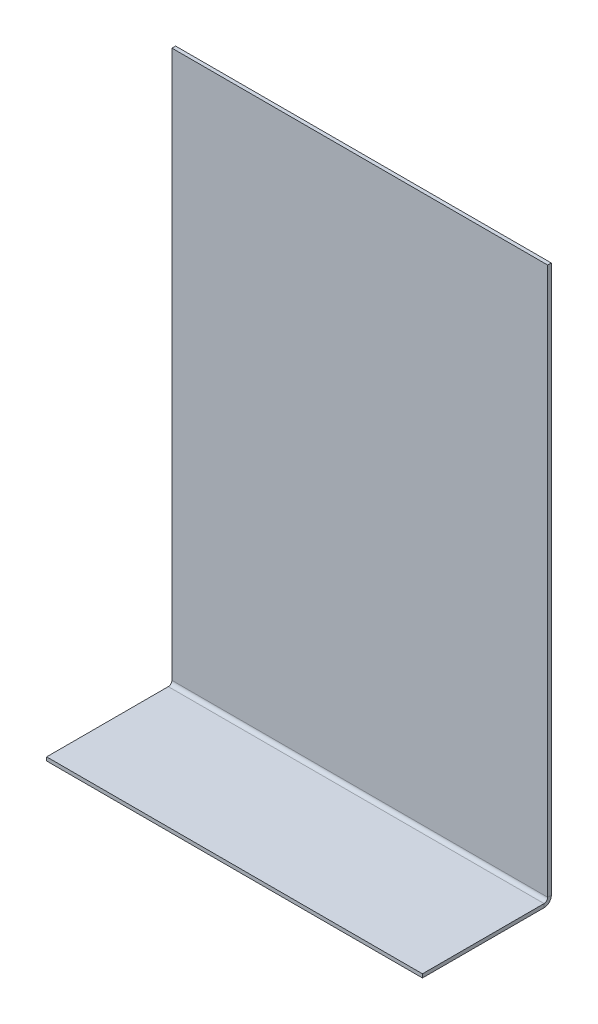
ISO-10303-21;
HEADER;
FILE_DESCRIPTION(('STEP AP214'),'2;1');
FILE_NAME('part.step','',(''),(''),'','','');
FILE_SCHEMA(('AUTOMOTIVE_DESIGN { 1 0 10303 214 1 1 1 1 }'));
ENDSEC;
DATA;
#1=APPLICATION_CONTEXT('core data for automotive mechanical design processes');
#2=APPLICATION_PROTOCOL_DEFINITION('international standard','automotive_design',2000,#1);
#3=PRODUCT_CONTEXT('',#1,'mechanical');
#4=PRODUCT('Part','Part','',(#3));
#5=PRODUCT_RELATED_PRODUCT_CATEGORY('part','',(#4));
#6=PRODUCT_DEFINITION_FORMATION('','',#4);
#7=PRODUCT_DEFINITION_CONTEXT('part definition',#1,'design');
#8=PRODUCT_DEFINITION('design','',#6,#7);
#9=PRODUCT_DEFINITION_SHAPE('','',#8);
#10=(LENGTH_UNIT() NAMED_UNIT(*) SI_UNIT(.MILLI.,.METRE.));
#11=(NAMED_UNIT(*) PLANE_ANGLE_UNIT() SI_UNIT($,.RADIAN.));
#12=(NAMED_UNIT(*) SI_UNIT($,.STERADIAN.) SOLID_ANGLE_UNIT());
#13=UNCERTAINTY_MEASURE_WITH_UNIT(LENGTH_MEASURE(1.E-05),#10,'distance_accuracy_value','');
#14=(GEOMETRIC_REPRESENTATION_CONTEXT(3) GLOBAL_UNCERTAINTY_ASSIGNED_CONTEXT((#13)) GLOBAL_UNIT_ASSIGNED_CONTEXT((#10,
#11,#12)) REPRESENTATION_CONTEXT('',''));
#15=CARTESIAN_POINT('',(0.,0.,0.));
#16=DIRECTION('',(0.,0.,1.));
#17=DIRECTION('',(1.,0.,0.));
#18=AXIS2_PLACEMENT_3D('',#15,#16,#17);
#19=CARTESIAN_POINT('',(0.,-0.7366,0.));
#20=DIRECTION('',(-1.,0.,0.));
#21=DIRECTION('',(0.,0.,1.));
#22=AXIS2_PLACEMENT_3D('',#19,#20,#21);
#23=PLANE('',#22);
#24=DIRECTION('',(0.,0.,1.));
#25=VECTOR('',#24,1.);
#26=CARTESIAN_POINT('',(0.,0.,0.));
#27=LINE('',#26,#25);
#28=CARTESIAN_POINT('',(0.,0.,-24.6634));
#29=VERTEX_POINT('',#28);
#30=CARTESIAN_POINT('',(0.,0.,0.));
#31=VERTEX_POINT('',#30);
#32=EDGE_CURVE('E91',#29,#31,#27,.T.);
#33=ORIENTED_EDGE('',*,*,#32,.F.);
#34=DIRECTION('',(0.,-1.,0.));
#35=VECTOR('',#34,1.);
#36=CARTESIAN_POINT('',(0.,0.,-24.6634));
#37=LINE('',#36,#35);
#38=CARTESIAN_POINT('',(0.,-0.736600000000008,-24.6634));
#39=VERTEX_POINT('',#38);
#40=EDGE_CURVE('E100',#29,#39,#37,.T.);
#41=ORIENTED_EDGE('',*,*,#40,.T.);
#42=DIRECTION('',(0.,0.,1.));
#43=VECTOR('',#42,1.);
#44=CARTESIAN_POINT('',(0.,-0.7366,0.));
#45=LINE('',#44,#43);
#46=CARTESIAN_POINT('',(0.,-0.7366,0.));
#47=VERTEX_POINT('',#46);
#48=EDGE_CURVE('E87',#39,#47,#45,.T.);
#49=ORIENTED_EDGE('',*,*,#48,.T.);
#50=DIRECTION('',(0.,1.,0.));
#51=VECTOR('',#50,1.);
#52=CARTESIAN_POINT('',(0.,-0.7366,0.));
#53=LINE('',#52,#51);
#54=EDGE_CURVE('E42',#47,#31,#53,.T.);
#55=ORIENTED_EDGE('',*,*,#54,.T.);
#56=EDGE_LOOP('',(#33,#41,#49,#55));
#57=FACE_BOUND('',#56,.T.);
#58=ADVANCED_FACE('F39',(#57),#23,.T.);
#59=CARTESIAN_POINT('',(0.,-0.7366,0.));
#60=DIRECTION('',(0.,-1.,0.));
#61=DIRECTION('',(0.,0.,-1.));
#62=AXIS2_PLACEMENT_3D('',#59,#60,#61);
#63=PLANE('',#62);
#64=ORIENTED_EDGE('',*,*,#48,.F.);
#65=DIRECTION('',(-1.,0.,0.));
#66=VECTOR('',#65,1.);
#67=CARTESIAN_POINT('',(0.,-0.736600000000008,-24.6634));
#68=LINE('',#67,#66);
#69=CARTESIAN_POINT('',(76.2,-0.7366,-24.6634));
#70=VERTEX_POINT('',#69);
#71=EDGE_CURVE('E117',#39,#70,#68,.F.);
#72=ORIENTED_EDGE('',*,*,#71,.T.);
#73=DIRECTION('',(0.,0.,-1.));
#74=VECTOR('',#73,1.);
#75=CARTESIAN_POINT('',(76.2,-0.7366,0.));
#76=LINE('',#75,#74);
#77=CARTESIAN_POINT('',(76.2,-0.7366,0.));
#78=VERTEX_POINT('',#77);
#79=EDGE_CURVE('E96',#78,#70,#76,.T.);
#80=ORIENTED_EDGE('',*,*,#79,.F.);
#81=DIRECTION('',(1.,0.,0.));
#82=VECTOR('',#81,1.);
#83=CARTESIAN_POINT('',(0.,-0.7366,0.));
#84=LINE('',#83,#82);
#85=EDGE_CURVE('E78',#47,#78,#84,.T.);
#86=ORIENTED_EDGE('',*,*,#85,.F.);
#87=EDGE_LOOP('',(#64,#72,#80,#86));
#88=FACE_BOUND('',#87,.T.);
#89=ADVANCED_FACE('F205',(#88),#63,.T.);
#90=CARTESIAN_POINT('',(0.,0.,0.));
#91=DIRECTION('',(0.,-1.,0.));
#92=DIRECTION('',(0.,0.,-1.));
#93=AXIS2_PLACEMENT_3D('',#90,#91,#92);
#94=PLANE('',#93);
#95=DIRECTION('',(-1.,0.,0.));
#96=VECTOR('',#95,1.);
#97=CARTESIAN_POINT('',(0.,0.,-24.6634));
#98=LINE('',#97,#96);
#99=CARTESIAN_POINT('',(76.1999999999999,0.,-24.6634));
#100=VERTEX_POINT('',#99);
#101=EDGE_CURVE('E107',#29,#100,#98,.F.);
#102=ORIENTED_EDGE('',*,*,#101,.F.);
#103=ORIENTED_EDGE('',*,*,#32,.T.);
#104=DIRECTION('',(1.,0.,0.));
#105=VECTOR('',#104,1.);
#106=CARTESIAN_POINT('',(0.,0.,0.));
#107=LINE('',#106,#105);
#108=CARTESIAN_POINT('',(76.2,0.,0.));
#109=VERTEX_POINT('',#108);
#110=EDGE_CURVE('E76',#31,#109,#107,.T.);
#111=ORIENTED_EDGE('',*,*,#110,.T.);
#112=DIRECTION('',(0.,0.,-1.));
#113=VECTOR('',#112,1.);
#114=CARTESIAN_POINT('',(76.2,0.,0.));
#115=LINE('',#114,#113);
#116=EDGE_CURVE('E81',#109,#100,#115,.T.);
#117=ORIENTED_EDGE('',*,*,#116,.T.);
#118=EDGE_LOOP('',(#102,#103,#111,#117));
#119=FACE_BOUND('',#118,.T.);
#120=ADVANCED_FACE('F89',(#119),#94,.F.);
#121=CARTESIAN_POINT('',(76.2,-0.7366,0.));
#122=DIRECTION('',(1.,0.,0.));
#123=DIRECTION('',(0.,0.,-1.));
#124=AXIS2_PLACEMENT_3D('',#121,#122,#123);
#125=PLANE('',#124);
#126=DIRECTION('',(0.,-1.,0.));
#127=VECTOR('',#126,1.);
#128=CARTESIAN_POINT('',(76.1999999999999,0.,-24.6634));
#129=LINE('',#128,#127);
#130=EDGE_CURVE('E84',#100,#70,#129,.T.);
#131=ORIENTED_EDGE('',*,*,#130,.F.);
#132=ORIENTED_EDGE('',*,*,#116,.F.);
#133=DIRECTION('',(0.,1.,0.));
#134=VECTOR('',#133,1.);
#135=CARTESIAN_POINT('',(76.2,-0.7366,0.));
#136=LINE('',#135,#134);
#137=EDGE_CURVE('E11',#78,#109,#136,.T.);
#138=ORIENTED_EDGE('',*,*,#137,.F.);
#139=ORIENTED_EDGE('',*,*,#79,.T.);
#140=EDGE_LOOP('',(#131,#132,#138,#139));
#141=FACE_BOUND('',#140,.T.);
#142=ADVANCED_FACE('F82',(#141),#125,.T.);
#143=CARTESIAN_POINT('',(0.,-0.7366,0.));
#144=DIRECTION('',(0.,0.,1.));
#145=DIRECTION('',(1.,0.,0.));
#146=AXIS2_PLACEMENT_3D('',#143,#144,#145);
#147=PLANE('',#146);
#148=ORIENTED_EDGE('',*,*,#110,.F.);
#149=ORIENTED_EDGE('',*,*,#54,.F.);
#150=ORIENTED_EDGE('',*,*,#85,.T.);
#151=ORIENTED_EDGE('',*,*,#137,.T.);
#152=EDGE_LOOP('',(#148,#149,#150,#151));
#153=FACE_BOUND('',#152,.T.);
#154=ADVANCED_FACE('F73',(#153),#147,.T.);
#155=CARTESIAN_POINT('',(76.1999999999999,0.736599999999992,-24.6634));
#156=DIRECTION('',(1.,0.,0.));
#157=DIRECTION('',(0.,0.,-1.));
#158=AXIS2_PLACEMENT_3D('',#155,#156,#157);
#159=PLANE('',#158);
#160=DIRECTION('',(0.,0.,-1.));
#161=VECTOR('',#160,1.);
#162=CARTESIAN_POINT('',(76.2,0.736599999999997,-25.4));
#163=LINE('',#162,#161);
#164=CARTESIAN_POINT('',(76.1999999999999,0.736599999999989,-25.4));
#165=VERTEX_POINT('',#164);
#166=CARTESIAN_POINT('',(76.1999999999999,0.736599999999987,-26.1366));
#167=VERTEX_POINT('',#166);
#168=EDGE_CURVE('E147',#165,#167,#163,.T.);
#169=ORIENTED_EDGE('',*,*,#168,.F.);
#170=CARTESIAN_POINT('',(76.1999999999999,0.736599999999992,-24.6634));
#171=DIRECTION('',(-1.,0.,0.));
#172=DIRECTION('',(0.,0.,1.));
#173=AXIS2_PLACEMENT_3D('',#170,#171,#172);
#174=CIRCLE('',#173,0.7366);
#175=EDGE_CURVE('E111',#100,#165,#174,.F.);
#176=ORIENTED_EDGE('',*,*,#175,.F.);
#177=ORIENTED_EDGE('',*,*,#130,.T.);
#178=CARTESIAN_POINT('',(76.1999999999999,0.736599999999992,-24.6634));
#179=DIRECTION('',(-1.,0.,0.));
#180=DIRECTION('',(0.,0.,1.));
#181=AXIS2_PLACEMENT_3D('',#178,#179,#180);
#182=CIRCLE('',#181,1.4732);
#183=EDGE_CURVE('E53',#70,#167,#182,.F.);
#184=ORIENTED_EDGE('',*,*,#183,.T.);
#185=EDGE_LOOP('',(#169,#176,#177,#184));
#186=FACE_BOUND('',#185,.T.);
#187=ADVANCED_FACE('F202',(#186),#159,.T.);
#188=CARTESIAN_POINT('',(0.,0.736599999999992,-24.6634));
#189=DIRECTION('',(1.,0.,0.));
#190=DIRECTION('',(0.,0.,-1.));
#191=AXIS2_PLACEMENT_3D('',#188,#189,#190);
#192=PLANE('',#191);
#193=CARTESIAN_POINT('',(0.,0.736599999999992,-24.6634));
#194=DIRECTION('',(-1.,0.,0.));
#195=DIRECTION('',(0.,0.,1.));
#196=AXIS2_PLACEMENT_3D('',#193,#194,#195);
#197=CIRCLE('',#196,0.7366);
#198=CARTESIAN_POINT('',(0.,0.736599999999989,-25.4));
#199=VERTEX_POINT('',#198);
#200=EDGE_CURVE('E104',#199,#29,#197,.T.);
#201=ORIENTED_EDGE('',*,*,#200,.F.);
#202=DIRECTION('',(0.,0.,-1.));
#203=VECTOR('',#202,1.);
#204=CARTESIAN_POINT('',(0.,0.736599999999997,-25.4));
#205=LINE('',#204,#203);
#206=CARTESIAN_POINT('',(0.,0.736600000000002,-26.1366));
#207=VERTEX_POINT('',#206);
#208=EDGE_CURVE('E146',#199,#207,#205,.T.);
#209=ORIENTED_EDGE('',*,*,#208,.T.);
#210=CARTESIAN_POINT('',(0.,0.736599999999992,-24.6634));
#211=DIRECTION('',(-1.,0.,0.));
#212=DIRECTION('',(0.,0.,1.));
#213=AXIS2_PLACEMENT_3D('',#210,#211,#212);
#214=CIRCLE('',#213,1.4732);
#215=EDGE_CURVE('E114',#207,#39,#214,.T.);
#216=ORIENTED_EDGE('',*,*,#215,.T.);
#217=ORIENTED_EDGE('',*,*,#40,.F.);
#218=EDGE_LOOP('',(#201,#209,#216,#217));
#219=FACE_BOUND('',#218,.T.);
#220=ADVANCED_FACE('F168',(#219),#192,.F.);
#221=CARTESIAN_POINT('',(0.,0.736599999999992,-24.6634));
#222=DIRECTION('',(-1.,0.,0.));
#223=DIRECTION('',(0.,0.,-1.));
#224=AXIS2_PLACEMENT_3D('',#221,#222,#223);
#225=CYLINDRICAL_SURFACE('',#224,1.4732);
#226=ORIENTED_EDGE('',*,*,#71,.F.);
#227=ORIENTED_EDGE('',*,*,#215,.F.);
#228=DIRECTION('',(1.,0.,0.));
#229=VECTOR('',#228,1.);
#230=CARTESIAN_POINT('',(0.,0.736600000000002,-26.1366));
#231=LINE('',#230,#229);
#232=EDGE_CURVE('E137',#207,#167,#231,.T.);
#233=ORIENTED_EDGE('',*,*,#232,.T.);
#234=ORIENTED_EDGE('',*,*,#183,.F.);
#235=EDGE_LOOP('',(#226,#227,#233,#234));
#236=FACE_BOUND('',#235,.T.);
#237=ADVANCED_FACE('F206',(#236),#225,.T.);
#238=CARTESIAN_POINT('',(0.,0.736599999999992,-24.6634));
#239=DIRECTION('',(-1.,0.,0.));
#240=DIRECTION('',(0.,0.,-1.));
#241=AXIS2_PLACEMENT_3D('',#238,#239,#240);
#242=CYLINDRICAL_SURFACE('',#241,0.7366);
#243=ORIENTED_EDGE('',*,*,#101,.T.);
#244=ORIENTED_EDGE('',*,*,#175,.T.);
#245=DIRECTION('',(-1.,0.,0.));
#246=VECTOR('',#245,1.);
#247=CARTESIAN_POINT('',(76.2,0.736599999999997,-25.4));
#248=LINE('',#247,#246);
#249=EDGE_CURVE('E150',#165,#199,#248,.T.);
#250=ORIENTED_EDGE('',*,*,#249,.T.);
#251=ORIENTED_EDGE('',*,*,#200,.T.);
#252=EDGE_LOOP('',(#243,#244,#250,#251));
#253=FACE_BOUND('',#252,.T.);
#254=ADVANCED_FACE('F158',(#253),#242,.F.);
#255=CARTESIAN_POINT('',(76.2,0.,-26.1366));
#256=DIRECTION('',(-1.,0.,0.));
#257=DIRECTION('',(0.,0.,1.));
#258=AXIS2_PLACEMENT_3D('',#255,#256,#257);
#259=PLANE('',#258);
#260=ORIENTED_EDGE('',*,*,#168,.T.);
#261=DIRECTION('',(0.,-1.,0.));
#262=VECTOR('',#261,1.);
#263=CARTESIAN_POINT('',(76.2,0.,-26.1366));
#264=LINE('',#263,#262);
#265=CARTESIAN_POINT('',(76.2,111.76,-26.1366000000004));
#266=VERTEX_POINT('',#265);
#267=EDGE_CURVE('E130',#266,#167,#264,.T.);
#268=ORIENTED_EDGE('',*,*,#267,.F.);
#269=DIRECTION('',(0.,0.,1.));
#270=VECTOR('',#269,1.);
#271=CARTESIAN_POINT('',(76.2,111.76,-26.1366000000004));
#272=LINE('',#271,#270);
#273=CARTESIAN_POINT('',(76.2,111.76,-25.4000000000004));
#274=VERTEX_POINT('',#273);
#275=EDGE_CURVE('E123',#266,#274,#272,.T.);
#276=ORIENTED_EDGE('',*,*,#275,.T.);
#277=DIRECTION('',(0.,-1.,0.));
#278=VECTOR('',#277,1.);
#279=CARTESIAN_POINT('',(76.2,0.,-25.4));
#280=LINE('',#279,#278);
#281=EDGE_CURVE('E134',#274,#165,#280,.T.);
#282=ORIENTED_EDGE('',*,*,#281,.T.);
#283=EDGE_LOOP('',(#260,#268,#276,#282));
#284=FACE_BOUND('',#283,.T.);
#285=ADVANCED_FACE('F189',(#284),#259,.F.);
#286=CARTESIAN_POINT('',(0.,111.76,-26.1366000000004));
#287=DIRECTION('',(1.,0.,0.));
#288=DIRECTION('',(0.,0.,-1.));
#289=AXIS2_PLACEMENT_3D('',#286,#287,#288);
#290=PLANE('',#289);
#291=ORIENTED_EDGE('',*,*,#208,.F.);
#292=DIRECTION('',(0.,1.,0.));
#293=VECTOR('',#292,1.);
#294=CARTESIAN_POINT('',(0.,111.76,-25.4000000000004));
#295=LINE('',#294,#293);
#296=CARTESIAN_POINT('',(0.,111.76,-25.4000000000004));
#297=VERTEX_POINT('',#296);
#298=EDGE_CURVE('E131',#199,#297,#295,.T.);
#299=ORIENTED_EDGE('',*,*,#298,.T.);
#300=DIRECTION('',(0.,0.,1.));
#301=VECTOR('',#300,1.);
#302=CARTESIAN_POINT('',(0.,111.76,-26.1366000000004));
#303=LINE('',#302,#301);
#304=CARTESIAN_POINT('',(0.,111.76,-26.1366000000004));
#305=VERTEX_POINT('',#304);
#306=EDGE_CURVE('E108',#305,#297,#303,.T.);
#307=ORIENTED_EDGE('',*,*,#306,.F.);
#308=DIRECTION('',(0.,1.,0.));
#309=VECTOR('',#308,1.);
#310=CARTESIAN_POINT('',(0.,111.76,-26.1366000000004));
#311=LINE('',#310,#309);
#312=EDGE_CURVE('E140',#207,#305,#311,.T.);
#313=ORIENTED_EDGE('',*,*,#312,.F.);
#314=EDGE_LOOP('',(#291,#299,#307,#313));
#315=FACE_BOUND('',#314,.T.);
#316=ADVANCED_FACE('F173',(#315),#290,.F.);
#317=CARTESIAN_POINT('',(0.,0.,-26.1366));
#318=DIRECTION('',(0.,0.,1.));
#319=DIRECTION('',(0.,-1.,0.));
#320=AXIS2_PLACEMENT_3D('',#317,#318,#319);
#321=PLANE('',#320);
#322=ORIENTED_EDGE('',*,*,#232,.F.);
#323=ORIENTED_EDGE('',*,*,#312,.T.);
#324=DIRECTION('',(1.,0.,0.));
#325=VECTOR('',#324,1.);
#326=CARTESIAN_POINT('',(76.2,111.76,-26.1366000000004));
#327=LINE('',#326,#325);
#328=EDGE_CURVE('E126',#305,#266,#327,.T.);
#329=ORIENTED_EDGE('',*,*,#328,.T.);
#330=ORIENTED_EDGE('',*,*,#267,.T.);
#331=EDGE_LOOP('',(#322,#323,#329,#330));
#332=FACE_BOUND('',#331,.T.);
#333=ADVANCED_FACE('F194',(#332),#321,.F.);
#334=CARTESIAN_POINT('',(0.,0.,-25.4));
#335=DIRECTION('',(0.,0.,1.));
#336=DIRECTION('',(0.,-1.,0.));
#337=AXIS2_PLACEMENT_3D('',#334,#335,#336);
#338=PLANE('',#337);
#339=ORIENTED_EDGE('',*,*,#298,.F.);
#340=ORIENTED_EDGE('',*,*,#249,.F.);
#341=ORIENTED_EDGE('',*,*,#281,.F.);
#342=DIRECTION('',(1.,0.,0.));
#343=VECTOR('',#342,1.);
#344=CARTESIAN_POINT('',(76.2,111.76,-25.4000000000004));
#345=LINE('',#344,#343);
#346=EDGE_CURVE('E127',#297,#274,#345,.T.);
#347=ORIENTED_EDGE('',*,*,#346,.F.);
#348=EDGE_LOOP('',(#339,#340,#341,#347));
#349=FACE_BOUND('',#348,.T.);
#350=ADVANCED_FACE('F177',(#349),#338,.T.);
#351=CARTESIAN_POINT('',(76.2,111.76,-26.1366000000004));
#352=DIRECTION('',(0.,-1.,0.));
#353=DIRECTION('',(0.,0.,-1.));
#354=AXIS2_PLACEMENT_3D('',#351,#352,#353);
#355=PLANE('',#354);
#356=ORIENTED_EDGE('',*,*,#346,.T.);
#357=ORIENTED_EDGE('',*,*,#275,.F.);
#358=ORIENTED_EDGE('',*,*,#328,.F.);
#359=ORIENTED_EDGE('',*,*,#306,.T.);
#360=EDGE_LOOP('',(#356,#357,#358,#359));
#361=FACE_BOUND('',#360,.T.);
#362=ADVANCED_FACE('F182',(#361),#355,.F.);
#363=CLOSED_SHELL('',(#58,#89,#120,#142,#154,#187,#220,#237,#254,#285,#316,#333,#350,#362));
#364=MANIFOLD_SOLID_BREP('B2',#363);
#365=ADVANCED_BREP_SHAPE_REPRESENTATION('',(#18,#364),#14);
#366=SHAPE_DEFINITION_REPRESENTATION(#9,#365);
ENDSEC;
END-ISO-10303-21;
